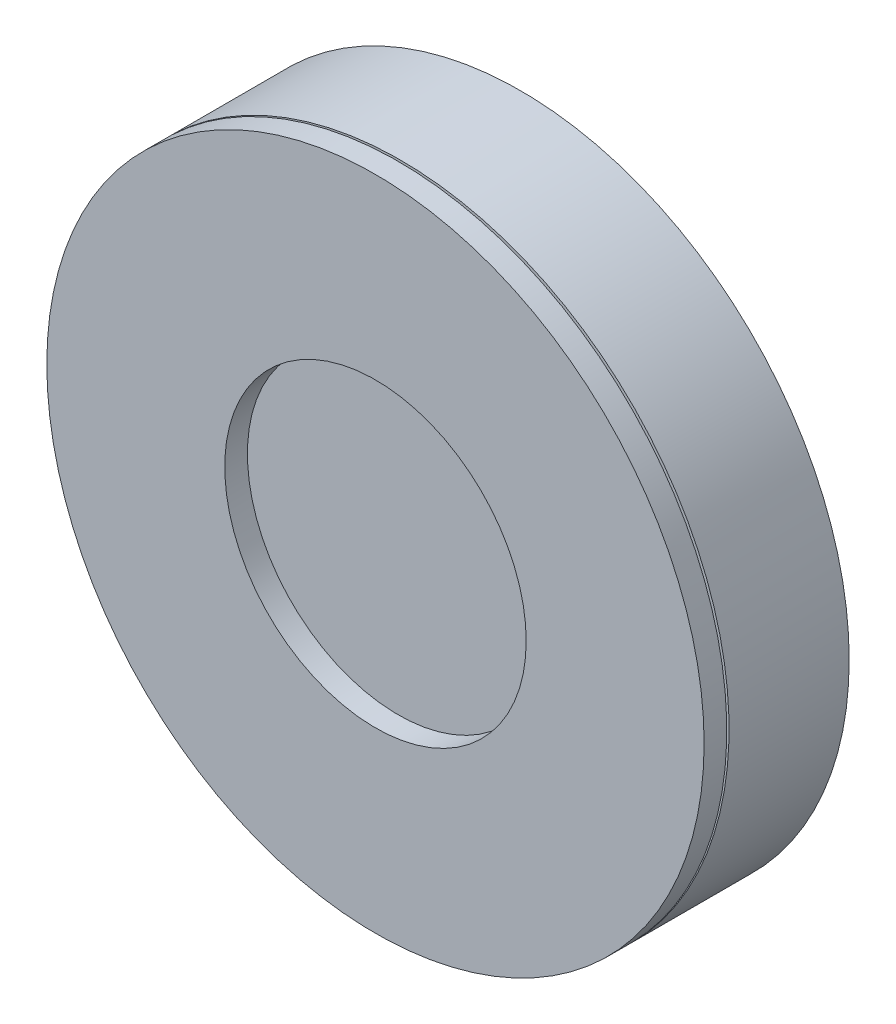
ISO-10303-21;
HEADER;
FILE_DESCRIPTION(('STEP AP214'),'2;1');
FILE_NAME('part.step','',(''),(''),'','','');
FILE_SCHEMA(('AUTOMOTIVE_DESIGN { 1 0 10303 214 1 1 1 1 }'));
ENDSEC;
DATA;
#1=APPLICATION_CONTEXT('core data for automotive mechanical design processes');
#2=APPLICATION_PROTOCOL_DEFINITION('international standard','automotive_design',2000,#1);
#3=PRODUCT_CONTEXT('',#1,'mechanical');
#4=PRODUCT('Part','Part','',(#3));
#5=PRODUCT_RELATED_PRODUCT_CATEGORY('part','',(#4));
#6=PRODUCT_DEFINITION_FORMATION('','',#4);
#7=PRODUCT_DEFINITION_CONTEXT('part definition',#1,'design');
#8=PRODUCT_DEFINITION('design','',#6,#7);
#9=PRODUCT_DEFINITION_SHAPE('','',#8);
#10=(LENGTH_UNIT() NAMED_UNIT(*) SI_UNIT(.MILLI.,.METRE.));
#11=(NAMED_UNIT(*) PLANE_ANGLE_UNIT() SI_UNIT($,.RADIAN.));
#12=(NAMED_UNIT(*) SI_UNIT($,.STERADIAN.) SOLID_ANGLE_UNIT());
#13=UNCERTAINTY_MEASURE_WITH_UNIT(LENGTH_MEASURE(1.E-05),#10,'distance_accuracy_value','');
#14=(GEOMETRIC_REPRESENTATION_CONTEXT(3) GLOBAL_UNCERTAINTY_ASSIGNED_CONTEXT((#13)) GLOBAL_UNIT_ASSIGNED_CONTEXT((#10,
#11,#12)) REPRESENTATION_CONTEXT('',''));
#15=CARTESIAN_POINT('',(0.,0.,0.));
#16=DIRECTION('',(0.,0.,1.));
#17=DIRECTION('',(1.,0.,0.));
#18=AXIS2_PLACEMENT_3D('',#15,#16,#17);
#19=CARTESIAN_POINT('',(0.,0.,32.));
#20=DIRECTION('',(0.,0.,-1.));
#21=DIRECTION('',(-1.,0.,0.));
#22=AXIS2_PLACEMENT_3D('',#19,#20,#21);
#23=CYLINDRICAL_SURFACE('',#22,72.5);
#24=CARTESIAN_POINT('',(0.,0.,0.));
#25=DIRECTION('',(0.,0.,1.));
#26=DIRECTION('',(1.,0.,0.));
#27=AXIS2_PLACEMENT_3D('',#24,#25,#26);
#28=CIRCLE('',#27,72.5);
#29=CARTESIAN_POINT('',(72.5,0.,0.));
#30=VERTEX_POINT('',#29);
#31=EDGE_CURVE('E34',#30,#30,#28,.T.);
#32=ORIENTED_EDGE('',*,*,#31,.T.);
#33=EDGE_LOOP('',(#32));
#34=FACE_BOUND('',#33,.T.);
#35=CARTESIAN_POINT('',(0.,0.,26.5));
#36=DIRECTION('',(0.,0.,-1.));
#37=DIRECTION('',(-1.,0.,0.));
#38=AXIS2_PLACEMENT_3D('',#35,#36,#37);
#39=CIRCLE('',#38,72.5);
#40=CARTESIAN_POINT('',(-72.5,0.,26.5));
#41=VERTEX_POINT('',#40);
#42=EDGE_CURVE('E41',#41,#41,#39,.T.);
#43=ORIENTED_EDGE('',*,*,#42,.T.);
#44=EDGE_LOOP('',(#43));
#45=FACE_BOUND('',#44,.T.);
#46=ADVANCED_FACE('F31',(#34,#45),#23,.T.);
#47=CARTESIAN_POINT('',(0.,0.,0.));
#48=DIRECTION('',(0.,0.,1.));
#49=DIRECTION('',(1.,0.,0.));
#50=AXIS2_PLACEMENT_3D('',#47,#48,#49);
#51=PLANE('',#50);
#52=ORIENTED_EDGE('',*,*,#31,.F.);
#53=EDGE_LOOP('',(#52));
#54=FACE_BOUND('',#53,.T.);
#55=ADVANCED_FACE('F84',(#54),#51,.F.);
#56=CARTESIAN_POINT('',(72.5,0.,26.5));
#57=DIRECTION('',(0.,0.,1.));
#58=DIRECTION('',(1.,0.,0.));
#59=AXIS2_PLACEMENT_3D('',#56,#57,#58);
#60=PLANE('',#59);
#61=CARTESIAN_POINT('',(0.,0.,26.5));
#62=DIRECTION('',(0.,0.,-1.));
#63=DIRECTION('',(-1.,0.,0.));
#64=AXIS2_PLACEMENT_3D('',#61,#62,#63);
#65=CIRCLE('',#64,71.5);
#66=CARTESIAN_POINT('',(-71.5,0.,26.5));
#67=VERTEX_POINT('',#66);
#68=EDGE_CURVE('E45',#67,#67,#65,.T.);
#69=ORIENTED_EDGE('',*,*,#68,.T.);
#70=EDGE_LOOP('',(#69));
#71=FACE_BOUND('',#70,.T.);
#72=ORIENTED_EDGE('',*,*,#42,.F.);
#73=EDGE_LOOP('',(#72));
#74=FACE_BOUND('',#73,.T.);
#75=ADVANCED_FACE('F89',(#71,#74),#60,.T.);
#76=CARTESIAN_POINT('',(0.,0.,0.));
#77=DIRECTION('',(0.,0.,-1.));
#78=DIRECTION('',(-1.,0.,0.));
#79=AXIS2_PLACEMENT_3D('',#76,#77,#78);
#80=CYLINDRICAL_SURFACE('',#79,71.5);
#81=CARTESIAN_POINT('',(0.,0.,27.));
#82=DIRECTION('',(0.,0.,-1.));
#83=DIRECTION('',(-1.,0.,0.));
#84=AXIS2_PLACEMENT_3D('',#81,#82,#83);
#85=CIRCLE('',#84,71.5);
#86=CARTESIAN_POINT('',(-71.5,0.,27.));
#87=VERTEX_POINT('',#86);
#88=EDGE_CURVE('E48',#87,#87,#85,.T.);
#89=ORIENTED_EDGE('',*,*,#88,.T.);
#90=EDGE_LOOP('',(#89));
#91=FACE_BOUND('',#90,.T.);
#92=ORIENTED_EDGE('',*,*,#68,.F.);
#93=EDGE_LOOP('',(#92));
#94=FACE_BOUND('',#93,.T.);
#95=ADVANCED_FACE('F79',(#91,#94),#80,.T.);
#96=CARTESIAN_POINT('',(72.5,0.,27.));
#97=DIRECTION('',(0.,0.,-1.));
#98=DIRECTION('',(-1.,0.,0.));
#99=AXIS2_PLACEMENT_3D('',#96,#97,#98);
#100=PLANE('',#99);
#101=CARTESIAN_POINT('',(0.,0.,27.));
#102=DIRECTION('',(0.,0.,-1.));
#103=DIRECTION('',(-1.,0.,0.));
#104=AXIS2_PLACEMENT_3D('',#101,#102,#103);
#105=CIRCLE('',#104,72.5);
#106=CARTESIAN_POINT('',(-72.5,0.,27.));
#107=VERTEX_POINT('',#106);
#108=EDGE_CURVE('E51',#107,#107,#105,.T.);
#109=ORIENTED_EDGE('',*,*,#108,.T.);
#110=EDGE_LOOP('',(#109));
#111=FACE_BOUND('',#110,.T.);
#112=ORIENTED_EDGE('',*,*,#88,.F.);
#113=EDGE_LOOP('',(#112));
#114=FACE_BOUND('',#113,.T.);
#115=ADVANCED_FACE('F72',(#111,#114),#100,.T.);
#116=CARTESIAN_POINT('',(0.,0.,32.));
#117=DIRECTION('',(0.,0.,1.));
#118=DIRECTION('',(1.,0.,0.));
#119=AXIS2_PLACEMENT_3D('',#116,#117,#118);
#120=PLANE('',#119);
#121=CARTESIAN_POINT('',(0.,0.,32.));
#122=DIRECTION('',(0.,0.,1.));
#123=DIRECTION('',(1.,0.,0.));
#124=AXIS2_PLACEMENT_3D('',#121,#122,#123);
#125=CIRCLE('',#124,33.25);
#126=CARTESIAN_POINT('',(33.25,0.,32.));
#127=VERTEX_POINT('',#126);
#128=EDGE_CURVE('E55',#127,#127,#125,.T.);
#129=ORIENTED_EDGE('',*,*,#128,.F.);
#130=EDGE_LOOP('',(#129));
#131=FACE_BOUND('',#130,.T.);
#132=CARTESIAN_POINT('',(0.,0.,32.));
#133=DIRECTION('',(0.,0.,1.));
#134=DIRECTION('',(1.,0.,0.));
#135=AXIS2_PLACEMENT_3D('',#132,#133,#134);
#136=CIRCLE('',#135,72.5);
#137=CARTESIAN_POINT('',(72.5,0.,32.));
#138=VERTEX_POINT('',#137);
#139=EDGE_CURVE('E10',#138,#138,#136,.T.);
#140=ORIENTED_EDGE('',*,*,#139,.T.);
#141=EDGE_LOOP('',(#140));
#142=FACE_BOUND('',#141,.T.);
#143=ADVANCED_FACE('F70',(#131,#142),#120,.T.);
#144=ORIENTED_EDGE('',*,*,#139,.F.);
#145=EDGE_LOOP('',(#144));
#146=FACE_BOUND('',#145,.T.);
#147=ORIENTED_EDGE('',*,*,#108,.F.);
#148=EDGE_LOOP('',(#147));
#149=FACE_BOUND('',#148,.T.);
#150=ADVANCED_FACE('F66',(#146,#149),#23,.T.);
#151=CARTESIAN_POINT('',(0.,0.,27.));
#152=DIRECTION('',(0.,0.,1.));
#153=DIRECTION('',(1.,0.,0.));
#154=AXIS2_PLACEMENT_3D('',#151,#152,#153);
#155=CYLINDRICAL_SURFACE('',#154,33.25);
#156=CARTESIAN_POINT('',(0.,0.,27.));
#157=DIRECTION('',(0.,0.,1.));
#158=DIRECTION('',(1.,0.,0.));
#159=AXIS2_PLACEMENT_3D('',#156,#157,#158);
#160=CIRCLE('',#159,33.25);
#161=CARTESIAN_POINT('',(33.25,0.,27.));
#162=VERTEX_POINT('',#161);
#163=EDGE_CURVE('E54',#162,#162,#160,.T.);
#164=ORIENTED_EDGE('',*,*,#163,.F.);
#165=EDGE_LOOP('',(#164));
#166=FACE_BOUND('',#165,.T.);
#167=ORIENTED_EDGE('',*,*,#128,.T.);
#168=EDGE_LOOP('',(#167));
#169=FACE_BOUND('',#168,.T.);
#170=ADVANCED_FACE('F63',(#166,#169),#155,.F.);
#171=CARTESIAN_POINT('',(0.,0.,27.));
#172=DIRECTION('',(0.,0.,1.));
#173=DIRECTION('',(1.,0.,0.));
#174=AXIS2_PLACEMENT_3D('',#171,#172,#173);
#175=PLANE('',#174);
#176=ORIENTED_EDGE('',*,*,#163,.T.);
#177=EDGE_LOOP('',(#176));
#178=FACE_BOUND('',#177,.T.);
#179=ADVANCED_FACE('F61',(#178),#175,.T.);
#180=CLOSED_SHELL('',(#46,#55,#75,#95,#115,#143,#150,#170,#179));
#181=MANIFOLD_SOLID_BREP('B2',#180);
#182=ADVANCED_BREP_SHAPE_REPRESENTATION('',(#18,#181),#14);
#183=SHAPE_DEFINITION_REPRESENTATION(#9,#182);
ENDSEC;
END-ISO-10303-21;
